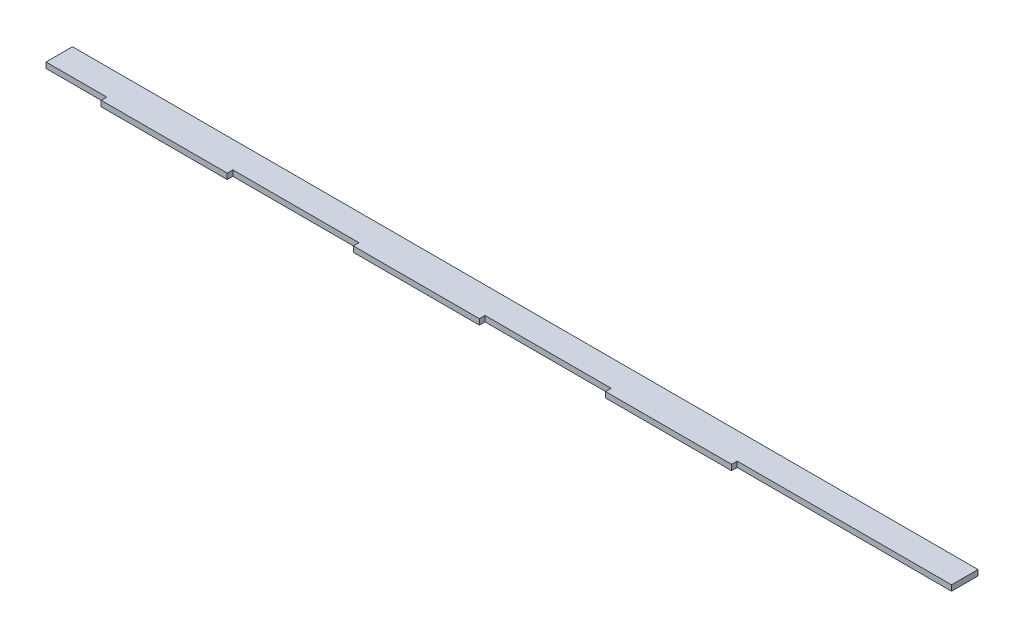
ISO-10303-21;
HEADER;
FILE_DESCRIPTION(('STEP AP214'),'2;1');
FILE_NAME('part.step','',(''),(''),'','','');
FILE_SCHEMA(('AUTOMOTIVE_DESIGN { 1 0 10303 214 1 1 1 1 }'));
ENDSEC;
DATA;
#1=APPLICATION_CONTEXT('core data for automotive mechanical design processes');
#2=APPLICATION_PROTOCOL_DEFINITION('international standard','automotive_design',2000,#1);
#3=PRODUCT_CONTEXT('',#1,'mechanical');
#4=PRODUCT('Part','Part','',(#3));
#5=PRODUCT_RELATED_PRODUCT_CATEGORY('part','',(#4));
#6=PRODUCT_DEFINITION_FORMATION('','',#4);
#7=PRODUCT_DEFINITION_CONTEXT('part definition',#1,'design');
#8=PRODUCT_DEFINITION('design','',#6,#7);
#9=PRODUCT_DEFINITION_SHAPE('','',#8);
#10=(LENGTH_UNIT() NAMED_UNIT(*) SI_UNIT(.MILLI.,.METRE.));
#11=(NAMED_UNIT(*) PLANE_ANGLE_UNIT() SI_UNIT($,.RADIAN.));
#12=(NAMED_UNIT(*) SI_UNIT($,.STERADIAN.) SOLID_ANGLE_UNIT());
#13=UNCERTAINTY_MEASURE_WITH_UNIT(LENGTH_MEASURE(1.E-05),#10,'distance_accuracy_value','');
#14=(GEOMETRIC_REPRESENTATION_CONTEXT(3) GLOBAL_UNCERTAINTY_ASSIGNED_CONTEXT((#13)) GLOBAL_UNIT_ASSIGNED_CONTEXT((#10,
#11,#12)) REPRESENTATION_CONTEXT('',''));
#15=CARTESIAN_POINT('',(0.,0.,0.));
#16=DIRECTION('',(0.,0.,1.));
#17=DIRECTION('',(1.,0.,0.));
#18=AXIS2_PLACEMENT_3D('',#15,#16,#17);
#19=CARTESIAN_POINT('',(528.557142857143,3.175,-14.9999999999998));
#20=DIRECTION('',(0.,0.,1.));
#21=DIRECTION('',(1.,0.,0.));
#22=AXIS2_PLACEMENT_3D('',#19,#20,#21);
#23=PLANE('',#22);
#24=DIRECTION('',(-1.,0.,0.));
#25=VECTOR('',#24,1.);
#26=CARTESIAN_POINT('',(528.557142857143,0.,-14.9999999999998));
#27=LINE('',#26,#25);
#28=CARTESIAN_POINT('',(528.557142857143,0.,-14.9999999999998));
#29=VERTEX_POINT('',#28);
#30=CARTESIAN_POINT('',(15.5571428571428,0.,-15.));
#31=VERTEX_POINT('',#30);
#32=EDGE_CURVE('E177',#29,#31,#27,.T.);
#33=ORIENTED_EDGE('',*,*,#32,.T.);
#34=DIRECTION('',(0.,-1.,0.));
#35=VECTOR('',#34,1.);
#36=CARTESIAN_POINT('',(15.5571428571428,3.175,-15.));
#37=LINE('',#36,#35);
#38=CARTESIAN_POINT('',(15.5571428571428,3.175,-15.));
#39=VERTEX_POINT('',#38);
#40=EDGE_CURVE('E11',#39,#31,#37,.T.);
#41=ORIENTED_EDGE('',*,*,#40,.F.);
#42=DIRECTION('',(-1.,0.,0.));
#43=VECTOR('',#42,1.);
#44=CARTESIAN_POINT('',(528.557142857143,3.175,-14.9999999999998));
#45=LINE('',#44,#43);
#46=CARTESIAN_POINT('',(528.557142857143,3.175,-14.9999999999998));
#47=VERTEX_POINT('',#46);
#48=EDGE_CURVE('E207',#47,#39,#45,.T.);
#49=ORIENTED_EDGE('',*,*,#48,.F.);
#50=DIRECTION('',(0.,-1.,0.));
#51=VECTOR('',#50,1.);
#52=CARTESIAN_POINT('',(528.557142857143,3.175,-14.9999999999998));
#53=LINE('',#52,#51);
#54=EDGE_CURVE('E173',#47,#29,#53,.T.);
#55=ORIENTED_EDGE('',*,*,#54,.T.);
#56=EDGE_LOOP('',(#33,#41,#49,#55));
#57=FACE_BOUND('',#56,.T.);
#58=ADVANCED_FACE('F33',(#57),#23,.F.);
#59=CARTESIAN_POINT('',(15.5571428571428,3.175,0.));
#60=DIRECTION('',(1.,0.,0.));
#61=DIRECTION('',(0.,0.,-1.));
#62=AXIS2_PLACEMENT_3D('',#59,#60,#61);
#63=PLANE('',#62);
#64=DIRECTION('',(0.,0.,1.));
#65=VECTOR('',#64,1.);
#66=CARTESIAN_POINT('',(15.5571428571428,0.,0.));
#67=LINE('',#66,#65);
#68=CARTESIAN_POINT('',(15.5571428571428,0.,0.));
#69=VERTEX_POINT('',#68);
#70=EDGE_CURVE('E180',#31,#69,#67,.T.);
#71=ORIENTED_EDGE('',*,*,#70,.T.);
#72=DIRECTION('',(0.,-1.,0.));
#73=VECTOR('',#72,1.);
#74=CARTESIAN_POINT('',(15.5571428571428,3.175,0.));
#75=LINE('',#74,#73);
#76=CARTESIAN_POINT('',(15.5571428571428,3.175,0.));
#77=VERTEX_POINT('',#76);
#78=EDGE_CURVE('E41',#77,#69,#75,.T.);
#79=ORIENTED_EDGE('',*,*,#78,.F.);
#80=DIRECTION('',(0.,0.,1.));
#81=VECTOR('',#80,1.);
#82=CARTESIAN_POINT('',(15.5571428571428,3.175,0.));
#83=LINE('',#82,#81);
#84=EDGE_CURVE('E116',#39,#77,#83,.T.);
#85=ORIENTED_EDGE('',*,*,#84,.F.);
#86=ORIENTED_EDGE('',*,*,#40,.T.);
#87=EDGE_LOOP('',(#71,#79,#85,#86));
#88=FACE_BOUND('',#87,.T.);
#89=ADVANCED_FACE('F305',(#88),#63,.F.);
#90=CARTESIAN_POINT('',(15.5571428571428,3.175,0.));
#91=DIRECTION('',(0.,0.,-1.));
#92=DIRECTION('',(-1.,0.,0.));
#93=AXIS2_PLACEMENT_3D('',#90,#91,#92);
#94=PLANE('',#93);
#95=DIRECTION('',(1.,0.,0.));
#96=VECTOR('',#95,1.);
#97=CARTESIAN_POINT('',(15.5571428571428,0.,0.));
#98=LINE('',#97,#96);
#99=CARTESIAN_POINT('',(49.9857142857143,0.,0.));
#100=VERTEX_POINT('',#99);
#101=EDGE_CURVE('E182',#69,#100,#98,.T.);
#102=ORIENTED_EDGE('',*,*,#101,.T.);
#103=DIRECTION('',(0.,-1.,0.));
#104=VECTOR('',#103,1.);
#105=CARTESIAN_POINT('',(49.9857142857143,3.175,0.));
#106=LINE('',#105,#104);
#107=CARTESIAN_POINT('',(49.9857142857143,3.175,0.));
#108=VERTEX_POINT('',#107);
#109=EDGE_CURVE('E238',#108,#100,#106,.T.);
#110=ORIENTED_EDGE('',*,*,#109,.F.);
#111=DIRECTION('',(1.,0.,0.));
#112=VECTOR('',#111,1.);
#113=CARTESIAN_POINT('',(15.5571428571428,3.175,0.));
#114=LINE('',#113,#112);
#115=EDGE_CURVE('E246',#77,#108,#114,.T.);
#116=ORIENTED_EDGE('',*,*,#115,.F.);
#117=ORIENTED_EDGE('',*,*,#78,.T.);
#118=EDGE_LOOP('',(#102,#110,#116,#117));
#119=FACE_BOUND('',#118,.T.);
#120=ADVANCED_FACE('F244',(#119),#94,.F.);
#121=CARTESIAN_POINT('',(49.9857142857143,3.175,3.17500000000006));
#122=DIRECTION('',(1.,0.,0.));
#123=DIRECTION('',(0.,0.,-1.));
#124=AXIS2_PLACEMENT_3D('',#121,#122,#123);
#125=PLANE('',#124);
#126=DIRECTION('',(0.,0.,1.));
#127=VECTOR('',#126,1.);
#128=CARTESIAN_POINT('',(49.9857142857143,0.,3.17500000000006));
#129=LINE('',#128,#127);
#130=CARTESIAN_POINT('',(49.9857142857143,0.,3.17500000000006));
#131=VERTEX_POINT('',#130);
#132=EDGE_CURVE('E184',#100,#131,#129,.T.);
#133=ORIENTED_EDGE('',*,*,#132,.T.);
#134=DIRECTION('',(0.,-1.,0.));
#135=VECTOR('',#134,1.);
#136=CARTESIAN_POINT('',(49.9857142857143,3.175,3.17500000000006));
#137=LINE('',#136,#135);
#138=CARTESIAN_POINT('',(49.9857142857143,3.175,3.17500000000006));
#139=VERTEX_POINT('',#138);
#140=EDGE_CURVE('E235',#139,#131,#137,.T.);
#141=ORIENTED_EDGE('',*,*,#140,.F.);
#142=DIRECTION('',(0.,0.,1.));
#143=VECTOR('',#142,1.);
#144=CARTESIAN_POINT('',(49.9857142857143,3.175,3.17500000000006));
#145=LINE('',#144,#143);
#146=EDGE_CURVE('E264',#108,#139,#145,.T.);
#147=ORIENTED_EDGE('',*,*,#146,.F.);
#148=ORIENTED_EDGE('',*,*,#109,.T.);
#149=EDGE_LOOP('',(#133,#141,#147,#148));
#150=FACE_BOUND('',#149,.T.);
#151=ADVANCED_FACE('F255',(#150),#125,.F.);
#152=CARTESIAN_POINT('',(49.9857142857143,3.175,3.17500000000006));
#153=DIRECTION('',(0.,0.,-1.));
#154=DIRECTION('',(-1.,0.,0.));
#155=AXIS2_PLACEMENT_3D('',#152,#153,#154);
#156=PLANE('',#155);
#157=DIRECTION('',(1.,0.,0.));
#158=VECTOR('',#157,1.);
#159=CARTESIAN_POINT('',(49.9857142857143,0.,3.17500000000006));
#160=LINE('',#159,#158);
#161=CARTESIAN_POINT('',(121.414285714286,0.,3.17500000000006));
#162=VERTEX_POINT('',#161);
#163=EDGE_CURVE('E186',#131,#162,#160,.T.);
#164=ORIENTED_EDGE('',*,*,#163,.T.);
#165=DIRECTION('',(0.,-1.,0.));
#166=VECTOR('',#165,1.);
#167=CARTESIAN_POINT('',(121.414285714286,3.175,3.17500000000006));
#168=LINE('',#167,#166);
#169=CARTESIAN_POINT('',(121.414285714286,3.175,3.17500000000006));
#170=VERTEX_POINT('',#169);
#171=EDGE_CURVE('E232',#170,#162,#168,.T.);
#172=ORIENTED_EDGE('',*,*,#171,.F.);
#173=DIRECTION('',(1.,0.,0.));
#174=VECTOR('',#173,1.);
#175=CARTESIAN_POINT('',(49.9857142857143,3.175,3.17500000000006));
#176=LINE('',#175,#174);
#177=EDGE_CURVE('E261',#139,#170,#176,.T.);
#178=ORIENTED_EDGE('',*,*,#177,.F.);
#179=ORIENTED_EDGE('',*,*,#140,.T.);
#180=EDGE_LOOP('',(#164,#172,#178,#179));
#181=FACE_BOUND('',#180,.T.);
#182=ADVANCED_FACE('F259',(#181),#156,.F.);
#183=CARTESIAN_POINT('',(121.414285714286,3.175,3.17500000000006));
#184=DIRECTION('',(-1.,0.,0.));
#185=DIRECTION('',(0.,0.,1.));
#186=AXIS2_PLACEMENT_3D('',#183,#184,#185);
#187=PLANE('',#186);
#188=DIRECTION('',(0.,0.,-1.));
#189=VECTOR('',#188,1.);
#190=CARTESIAN_POINT('',(121.414285714286,0.,3.17500000000006));
#191=LINE('',#190,#189);
#192=CARTESIAN_POINT('',(121.414285714286,0.,0.));
#193=VERTEX_POINT('',#192);
#194=EDGE_CURVE('E188',#162,#193,#191,.T.);
#195=ORIENTED_EDGE('',*,*,#194,.T.);
#196=DIRECTION('',(0.,-1.,0.));
#197=VECTOR('',#196,1.);
#198=CARTESIAN_POINT('',(121.414285714286,3.175,0.));
#199=LINE('',#198,#197);
#200=CARTESIAN_POINT('',(121.414285714286,3.175,0.));
#201=VERTEX_POINT('',#200);
#202=EDGE_CURVE('E229',#201,#193,#199,.T.);
#203=ORIENTED_EDGE('',*,*,#202,.F.);
#204=DIRECTION('',(0.,0.,-1.));
#205=VECTOR('',#204,1.);
#206=CARTESIAN_POINT('',(121.414285714286,3.175,3.17500000000006));
#207=LINE('',#206,#205);
#208=EDGE_CURVE('E263',#170,#201,#207,.T.);
#209=ORIENTED_EDGE('',*,*,#208,.F.);
#210=ORIENTED_EDGE('',*,*,#171,.T.);
#211=EDGE_LOOP('',(#195,#203,#209,#210));
#212=FACE_BOUND('',#211,.T.);
#213=ADVANCED_FACE('F318',(#212),#187,.F.);
#214=CARTESIAN_POINT('',(121.414285714286,3.175,0.));
#215=DIRECTION('',(0.,0.,-1.));
#216=DIRECTION('',(-1.,0.,0.));
#217=AXIS2_PLACEMENT_3D('',#214,#215,#216);
#218=PLANE('',#217);
#219=DIRECTION('',(1.,0.,0.));
#220=VECTOR('',#219,1.);
#221=CARTESIAN_POINT('',(121.414285714286,0.,0.));
#222=LINE('',#221,#220);
#223=CARTESIAN_POINT('',(192.842857142857,0.,0.));
#224=VERTEX_POINT('',#223);
#225=EDGE_CURVE('E190',#193,#224,#222,.T.);
#226=ORIENTED_EDGE('',*,*,#225,.T.);
#227=DIRECTION('',(0.,-1.,0.));
#228=VECTOR('',#227,1.);
#229=CARTESIAN_POINT('',(192.842857142857,3.175,0.));
#230=LINE('',#229,#228);
#231=CARTESIAN_POINT('',(192.842857142857,3.175,0.));
#232=VERTEX_POINT('',#231);
#233=EDGE_CURVE('E226',#232,#224,#230,.T.);
#234=ORIENTED_EDGE('',*,*,#233,.F.);
#235=DIRECTION('',(1.,0.,0.));
#236=VECTOR('',#235,1.);
#237=CARTESIAN_POINT('',(121.414285714286,3.175,0.));
#238=LINE('',#237,#236);
#239=EDGE_CURVE('E266',#201,#232,#238,.T.);
#240=ORIENTED_EDGE('',*,*,#239,.F.);
#241=ORIENTED_EDGE('',*,*,#202,.T.);
#242=EDGE_LOOP('',(#226,#234,#240,#241));
#243=FACE_BOUND('',#242,.T.);
#244=ADVANCED_FACE('F321',(#243),#218,.F.);
#245=CARTESIAN_POINT('',(192.842857142857,3.175,3.17500000000006));
#246=DIRECTION('',(1.,0.,0.));
#247=DIRECTION('',(0.,0.,-1.));
#248=AXIS2_PLACEMENT_3D('',#245,#246,#247);
#249=PLANE('',#248);
#250=DIRECTION('',(0.,0.,1.));
#251=VECTOR('',#250,1.);
#252=CARTESIAN_POINT('',(192.842857142857,0.,3.17500000000006));
#253=LINE('',#252,#251);
#254=CARTESIAN_POINT('',(192.842857142857,0.,3.17500000000006));
#255=VERTEX_POINT('',#254);
#256=EDGE_CURVE('E192',#224,#255,#253,.T.);
#257=ORIENTED_EDGE('',*,*,#256,.T.);
#258=DIRECTION('',(0.,-1.,0.));
#259=VECTOR('',#258,1.);
#260=CARTESIAN_POINT('',(192.842857142857,3.175,3.17500000000006));
#261=LINE('',#260,#259);
#262=CARTESIAN_POINT('',(192.842857142857,3.175,3.17500000000006));
#263=VERTEX_POINT('',#262);
#264=EDGE_CURVE('E223',#263,#255,#261,.T.);
#265=ORIENTED_EDGE('',*,*,#264,.F.);
#266=DIRECTION('',(0.,0.,1.));
#267=VECTOR('',#266,1.);
#268=CARTESIAN_POINT('',(192.842857142857,3.175,3.17500000000006));
#269=LINE('',#268,#267);
#270=EDGE_CURVE('E272',#232,#263,#269,.T.);
#271=ORIENTED_EDGE('',*,*,#270,.F.);
#272=ORIENTED_EDGE('',*,*,#233,.T.);
#273=EDGE_LOOP('',(#257,#265,#271,#272));
#274=FACE_BOUND('',#273,.T.);
#275=ADVANCED_FACE('F325',(#274),#249,.F.);
#276=CARTESIAN_POINT('',(192.842857142857,3.175,3.17500000000006));
#277=DIRECTION('',(0.,0.,-1.));
#278=DIRECTION('',(-1.,0.,0.));
#279=AXIS2_PLACEMENT_3D('',#276,#277,#278);
#280=PLANE('',#279);
#281=DIRECTION('',(1.,0.,0.));
#282=VECTOR('',#281,1.);
#283=CARTESIAN_POINT('',(192.842857142857,0.,3.17500000000006));
#284=LINE('',#283,#282);
#285=CARTESIAN_POINT('',(264.271428571429,0.,3.17500000000006));
#286=VERTEX_POINT('',#285);
#287=EDGE_CURVE('E194',#255,#286,#284,.T.);
#288=ORIENTED_EDGE('',*,*,#287,.T.);
#289=DIRECTION('',(0.,-1.,0.));
#290=VECTOR('',#289,1.);
#291=CARTESIAN_POINT('',(264.271428571429,3.175,3.17500000000006));
#292=LINE('',#291,#290);
#293=CARTESIAN_POINT('',(264.271428571429,3.175,3.17500000000006));
#294=VERTEX_POINT('',#293);
#295=EDGE_CURVE('E220',#294,#286,#292,.T.);
#296=ORIENTED_EDGE('',*,*,#295,.F.);
#297=DIRECTION('',(1.,0.,0.));
#298=VECTOR('',#297,1.);
#299=CARTESIAN_POINT('',(192.842857142857,3.175,3.17500000000006));
#300=LINE('',#299,#298);
#301=EDGE_CURVE('E274',#263,#294,#300,.T.);
#302=ORIENTED_EDGE('',*,*,#301,.F.);
#303=ORIENTED_EDGE('',*,*,#264,.T.);
#304=EDGE_LOOP('',(#288,#296,#302,#303));
#305=FACE_BOUND('',#304,.T.);
#306=ADVANCED_FACE('F329',(#305),#280,.F.);
#307=CARTESIAN_POINT('',(264.271428571429,3.175,3.17500000000006));
#308=DIRECTION('',(-1.,0.,0.));
#309=DIRECTION('',(0.,0.,1.));
#310=AXIS2_PLACEMENT_3D('',#307,#308,#309);
#311=PLANE('',#310);
#312=DIRECTION('',(0.,0.,-1.));
#313=VECTOR('',#312,1.);
#314=CARTESIAN_POINT('',(264.271428571429,0.,3.17500000000006));
#315=LINE('',#314,#313);
#316=CARTESIAN_POINT('',(264.271428571429,0.,0.));
#317=VERTEX_POINT('',#316);
#318=EDGE_CURVE('E196',#286,#317,#315,.T.);
#319=ORIENTED_EDGE('',*,*,#318,.T.);
#320=DIRECTION('',(0.,-1.,0.));
#321=VECTOR('',#320,1.);
#322=CARTESIAN_POINT('',(264.271428571429,3.175,0.));
#323=LINE('',#322,#321);
#324=CARTESIAN_POINT('',(264.271428571429,3.175,0.));
#325=VERTEX_POINT('',#324);
#326=EDGE_CURVE('E217',#325,#317,#323,.T.);
#327=ORIENTED_EDGE('',*,*,#326,.F.);
#328=DIRECTION('',(0.,0.,-1.));
#329=VECTOR('',#328,1.);
#330=CARTESIAN_POINT('',(264.271428571429,3.175,3.17500000000006));
#331=LINE('',#330,#329);
#332=EDGE_CURVE('E276',#294,#325,#331,.T.);
#333=ORIENTED_EDGE('',*,*,#332,.F.);
#334=ORIENTED_EDGE('',*,*,#295,.T.);
#335=EDGE_LOOP('',(#319,#327,#333,#334));
#336=FACE_BOUND('',#335,.T.);
#337=ADVANCED_FACE('F333',(#336),#311,.F.);
#338=CARTESIAN_POINT('',(264.271428571429,3.175,0.));
#339=DIRECTION('',(0.,0.,-1.));
#340=DIRECTION('',(-1.,0.,0.));
#341=AXIS2_PLACEMENT_3D('',#338,#339,#340);
#342=PLANE('',#341);
#343=DIRECTION('',(1.,0.,0.));
#344=VECTOR('',#343,1.);
#345=CARTESIAN_POINT('',(264.271428571429,0.,0.));
#346=LINE('',#345,#344);
#347=CARTESIAN_POINT('',(335.7,0.,0.));
#348=VERTEX_POINT('',#347);
#349=EDGE_CURVE('E198',#317,#348,#346,.T.);
#350=ORIENTED_EDGE('',*,*,#349,.T.);
#351=DIRECTION('',(0.,-1.,0.));
#352=VECTOR('',#351,1.);
#353=CARTESIAN_POINT('',(335.7,3.175,0.));
#354=LINE('',#353,#352);
#355=CARTESIAN_POINT('',(335.7,3.175,0.));
#356=VERTEX_POINT('',#355);
#357=EDGE_CURVE('E214',#356,#348,#354,.T.);
#358=ORIENTED_EDGE('',*,*,#357,.F.);
#359=DIRECTION('',(1.,0.,0.));
#360=VECTOR('',#359,1.);
#361=CARTESIAN_POINT('',(264.271428571429,3.175,0.));
#362=LINE('',#361,#360);
#363=EDGE_CURVE('E278',#325,#356,#362,.T.);
#364=ORIENTED_EDGE('',*,*,#363,.F.);
#365=ORIENTED_EDGE('',*,*,#326,.T.);
#366=EDGE_LOOP('',(#350,#358,#364,#365));
#367=FACE_BOUND('',#366,.T.);
#368=ADVANCED_FACE('F337',(#367),#342,.F.);
#369=CARTESIAN_POINT('',(335.7,3.175,3.17500000000006));
#370=DIRECTION('',(1.,0.,0.));
#371=DIRECTION('',(0.,0.,-1.));
#372=AXIS2_PLACEMENT_3D('',#369,#370,#371);
#373=PLANE('',#372);
#374=DIRECTION('',(0.,0.,1.));
#375=VECTOR('',#374,1.);
#376=CARTESIAN_POINT('',(335.7,0.,3.17500000000006));
#377=LINE('',#376,#375);
#378=CARTESIAN_POINT('',(335.7,0.,3.17500000000006));
#379=VERTEX_POINT('',#378);
#380=EDGE_CURVE('E200',#348,#379,#377,.T.);
#381=ORIENTED_EDGE('',*,*,#380,.T.);
#382=DIRECTION('',(0.,-1.,0.));
#383=VECTOR('',#382,1.);
#384=CARTESIAN_POINT('',(335.7,3.175,3.17500000000006));
#385=LINE('',#384,#383);
#386=CARTESIAN_POINT('',(335.7,3.175,3.17500000000006));
#387=VERTEX_POINT('',#386);
#388=EDGE_CURVE('E211',#387,#379,#385,.T.);
#389=ORIENTED_EDGE('',*,*,#388,.F.);
#390=DIRECTION('',(0.,0.,1.));
#391=VECTOR('',#390,1.);
#392=CARTESIAN_POINT('',(335.7,3.175,3.17500000000006));
#393=LINE('',#392,#391);
#394=EDGE_CURVE('E280',#356,#387,#393,.T.);
#395=ORIENTED_EDGE('',*,*,#394,.F.);
#396=ORIENTED_EDGE('',*,*,#357,.T.);
#397=EDGE_LOOP('',(#381,#389,#395,#396));
#398=FACE_BOUND('',#397,.T.);
#399=ADVANCED_FACE('F286',(#398),#373,.F.);
#400=CARTESIAN_POINT('',(335.7,3.175,3.17500000000006));
#401=DIRECTION('',(0.,0.,-1.));
#402=DIRECTION('',(-1.,0.,0.));
#403=AXIS2_PLACEMENT_3D('',#400,#401,#402);
#404=PLANE('',#403);
#405=DIRECTION('',(1.,0.,0.));
#406=VECTOR('',#405,1.);
#407=CARTESIAN_POINT('',(335.7,0.,3.17500000000006));
#408=LINE('',#407,#406);
#409=CARTESIAN_POINT('',(407.128571428571,0.,3.17500000000006));
#410=VERTEX_POINT('',#409);
#411=EDGE_CURVE('E202',#379,#410,#408,.T.);
#412=ORIENTED_EDGE('',*,*,#411,.T.);
#413=DIRECTION('',(0.,-1.,0.));
#414=VECTOR('',#413,1.);
#415=CARTESIAN_POINT('',(407.128571428571,3.175,3.17500000000006));
#416=LINE('',#415,#414);
#417=CARTESIAN_POINT('',(407.128571428571,3.175,3.17500000000006));
#418=VERTEX_POINT('',#417);
#419=EDGE_CURVE('E168',#418,#410,#416,.T.);
#420=ORIENTED_EDGE('',*,*,#419,.F.);
#421=DIRECTION('',(1.,0.,0.));
#422=VECTOR('',#421,1.);
#423=CARTESIAN_POINT('',(335.7,3.175,3.17500000000006));
#424=LINE('',#423,#422);
#425=EDGE_CURVE('E159',#387,#418,#424,.T.);
#426=ORIENTED_EDGE('',*,*,#425,.F.);
#427=ORIENTED_EDGE('',*,*,#388,.T.);
#428=EDGE_LOOP('',(#412,#420,#426,#427));
#429=FACE_BOUND('',#428,.T.);
#430=ADVANCED_FACE('F290',(#429),#404,.F.);
#431=CARTESIAN_POINT('',(407.128571428571,3.175,3.17500000000006));
#432=DIRECTION('',(-1.,0.,0.));
#433=DIRECTION('',(0.,0.,1.));
#434=AXIS2_PLACEMENT_3D('',#431,#432,#433);
#435=PLANE('',#434);
#436=DIRECTION('',(0.,0.,-1.));
#437=VECTOR('',#436,1.);
#438=CARTESIAN_POINT('',(407.128571428571,0.,3.17500000000006));
#439=LINE('',#438,#437);
#440=CARTESIAN_POINT('',(407.128571428571,0.,0.));
#441=VERTEX_POINT('',#440);
#442=EDGE_CURVE('E167',#410,#441,#439,.T.);
#443=ORIENTED_EDGE('',*,*,#442,.T.);
#444=DIRECTION('',(0.,-1.,0.));
#445=VECTOR('',#444,1.);
#446=CARTESIAN_POINT('',(407.128571428571,3.175,0.));
#447=LINE('',#446,#445);
#448=CARTESIAN_POINT('',(407.128571428571,3.175,0.));
#449=VERTEX_POINT('',#448);
#450=EDGE_CURVE('E164',#449,#441,#447,.T.);
#451=ORIENTED_EDGE('',*,*,#450,.F.);
#452=DIRECTION('',(0.,0.,-1.));
#453=VECTOR('',#452,1.);
#454=CARTESIAN_POINT('',(407.128571428571,3.175,3.17500000000006));
#455=LINE('',#454,#453);
#456=EDGE_CURVE('E153',#418,#449,#455,.T.);
#457=ORIENTED_EDGE('',*,*,#456,.F.);
#458=ORIENTED_EDGE('',*,*,#419,.T.);
#459=EDGE_LOOP('',(#443,#451,#457,#458));
#460=FACE_BOUND('',#459,.T.);
#461=ADVANCED_FACE('F165',(#460),#435,.F.);
#462=CARTESIAN_POINT('',(407.128571428571,3.175,0.));
#463=DIRECTION('',(0.,0.,-1.));
#464=DIRECTION('',(-1.,0.,0.));
#465=AXIS2_PLACEMENT_3D('',#462,#463,#464);
#466=PLANE('',#465);
#467=DIRECTION('',(1.,0.,0.));
#468=VECTOR('',#467,1.);
#469=CARTESIAN_POINT('',(407.128571428571,0.,0.));
#470=LINE('',#469,#468);
#471=CARTESIAN_POINT('',(528.557142857143,0.,2.22044604925031E-13));
#472=VERTEX_POINT('',#471);
#473=EDGE_CURVE('E102',#441,#472,#470,.T.);
#474=ORIENTED_EDGE('',*,*,#473,.T.);
#475=DIRECTION('',(0.,-1.,0.));
#476=VECTOR('',#475,1.);
#477=CARTESIAN_POINT('',(528.557142857143,3.175,2.22044604925031E-13));
#478=LINE('',#477,#476);
#479=CARTESIAN_POINT('',(528.557142857143,3.175,2.22044604925031E-13));
#480=VERTEX_POINT('',#479);
#481=EDGE_CURVE('E169',#480,#472,#478,.T.);
#482=ORIENTED_EDGE('',*,*,#481,.F.);
#483=DIRECTION('',(1.,0.,0.));
#484=VECTOR('',#483,1.);
#485=CARTESIAN_POINT('',(407.128571428571,3.175,0.));
#486=LINE('',#485,#484);
#487=EDGE_CURVE('E157',#449,#480,#486,.T.);
#488=ORIENTED_EDGE('',*,*,#487,.F.);
#489=ORIENTED_EDGE('',*,*,#450,.T.);
#490=EDGE_LOOP('',(#474,#482,#488,#489));
#491=FACE_BOUND('',#490,.T.);
#492=ADVANCED_FACE('F171',(#491),#466,.F.);
#493=CARTESIAN_POINT('',(528.557142857143,3.175,2.22044604925031E-13));
#494=DIRECTION('',(-1.,0.,0.));
#495=DIRECTION('',(0.,0.,1.));
#496=AXIS2_PLACEMENT_3D('',#493,#494,#495);
#497=PLANE('',#496);
#498=DIRECTION('',(0.,0.,-1.));
#499=VECTOR('',#498,1.);
#500=CARTESIAN_POINT('',(528.557142857143,0.,2.22044604925031E-13));
#501=LINE('',#500,#499);
#502=EDGE_CURVE('E108',#472,#29,#501,.T.);
#503=ORIENTED_EDGE('',*,*,#502,.T.);
#504=ORIENTED_EDGE('',*,*,#54,.F.);
#505=DIRECTION('',(0.,0.,-1.));
#506=VECTOR('',#505,1.);
#507=CARTESIAN_POINT('',(528.557142857143,3.175,2.22044604925031E-13));
#508=LINE('',#507,#506);
#509=EDGE_CURVE('E49',#480,#47,#508,.T.);
#510=ORIENTED_EDGE('',*,*,#509,.F.);
#511=ORIENTED_EDGE('',*,*,#481,.T.);
#512=EDGE_LOOP('',(#503,#504,#510,#511));
#513=FACE_BOUND('',#512,.T.);
#514=ADVANCED_FACE('F294',(#513),#497,.F.);
#515=CARTESIAN_POINT('',(0.,3.175,0.));
#516=DIRECTION('',(0.,-1.,0.));
#517=DIRECTION('',(0.,0.,-1.));
#518=AXIS2_PLACEMENT_3D('',#515,#516,#517);
#519=PLANE('',#518);
#520=ORIENTED_EDGE('',*,*,#48,.T.);
#521=ORIENTED_EDGE('',*,*,#84,.T.);
#522=ORIENTED_EDGE('',*,*,#115,.T.);
#523=ORIENTED_EDGE('',*,*,#146,.T.);
#524=ORIENTED_EDGE('',*,*,#177,.T.);
#525=ORIENTED_EDGE('',*,*,#208,.T.);
#526=ORIENTED_EDGE('',*,*,#239,.T.);
#527=ORIENTED_EDGE('',*,*,#270,.T.);
#528=ORIENTED_EDGE('',*,*,#301,.T.);
#529=ORIENTED_EDGE('',*,*,#332,.T.);
#530=ORIENTED_EDGE('',*,*,#363,.T.);
#531=ORIENTED_EDGE('',*,*,#394,.T.);
#532=ORIENTED_EDGE('',*,*,#425,.T.);
#533=ORIENTED_EDGE('',*,*,#456,.T.);
#534=ORIENTED_EDGE('',*,*,#487,.T.);
#535=ORIENTED_EDGE('',*,*,#509,.T.);
#536=EDGE_LOOP('',(#520,#521,#522,#523,#524,#525,#526,#527,#528,#529,#530,#531,#532,#533,#534,#535));
#537=FACE_BOUND('',#536,.T.);
#538=ADVANCED_FACE('F155',(#537),#519,.F.);
#539=CARTESIAN_POINT('',(0.,0.,0.));
#540=DIRECTION('',(0.,-1.,0.));
#541=DIRECTION('',(0.,0.,-1.));
#542=AXIS2_PLACEMENT_3D('',#539,#540,#541);
#543=PLANE('',#542);
#544=ORIENTED_EDGE('',*,*,#32,.F.);
#545=ORIENTED_EDGE('',*,*,#502,.F.);
#546=ORIENTED_EDGE('',*,*,#473,.F.);
#547=ORIENTED_EDGE('',*,*,#442,.F.);
#548=ORIENTED_EDGE('',*,*,#411,.F.);
#549=ORIENTED_EDGE('',*,*,#380,.F.);
#550=ORIENTED_EDGE('',*,*,#349,.F.);
#551=ORIENTED_EDGE('',*,*,#318,.F.);
#552=ORIENTED_EDGE('',*,*,#287,.F.);
#553=ORIENTED_EDGE('',*,*,#256,.F.);
#554=ORIENTED_EDGE('',*,*,#225,.F.);
#555=ORIENTED_EDGE('',*,*,#194,.F.);
#556=ORIENTED_EDGE('',*,*,#163,.F.);
#557=ORIENTED_EDGE('',*,*,#132,.F.);
#558=ORIENTED_EDGE('',*,*,#101,.F.);
#559=ORIENTED_EDGE('',*,*,#70,.F.);
#560=EDGE_LOOP('',(#544,#545,#546,#547,#548,#549,#550,#551,#552,#553,#554,#555,#556,#557,#558,#559));
#561=FACE_BOUND('',#560,.T.);
#562=ADVANCED_FACE('F250',(#561),#543,.T.);
#563=CLOSED_SHELL('',(#58,#89,#120,#151,#182,#213,#244,#275,#306,#337,#368,#399,#430,#461,#492,
#514,#538,#562));
#564=MANIFOLD_SOLID_BREP('B2',#563);
#565=ADVANCED_BREP_SHAPE_REPRESENTATION('',(#18,#564),#14);
#566=SHAPE_DEFINITION_REPRESENTATION(#9,#565);
ENDSEC;
END-ISO-10303-21;
